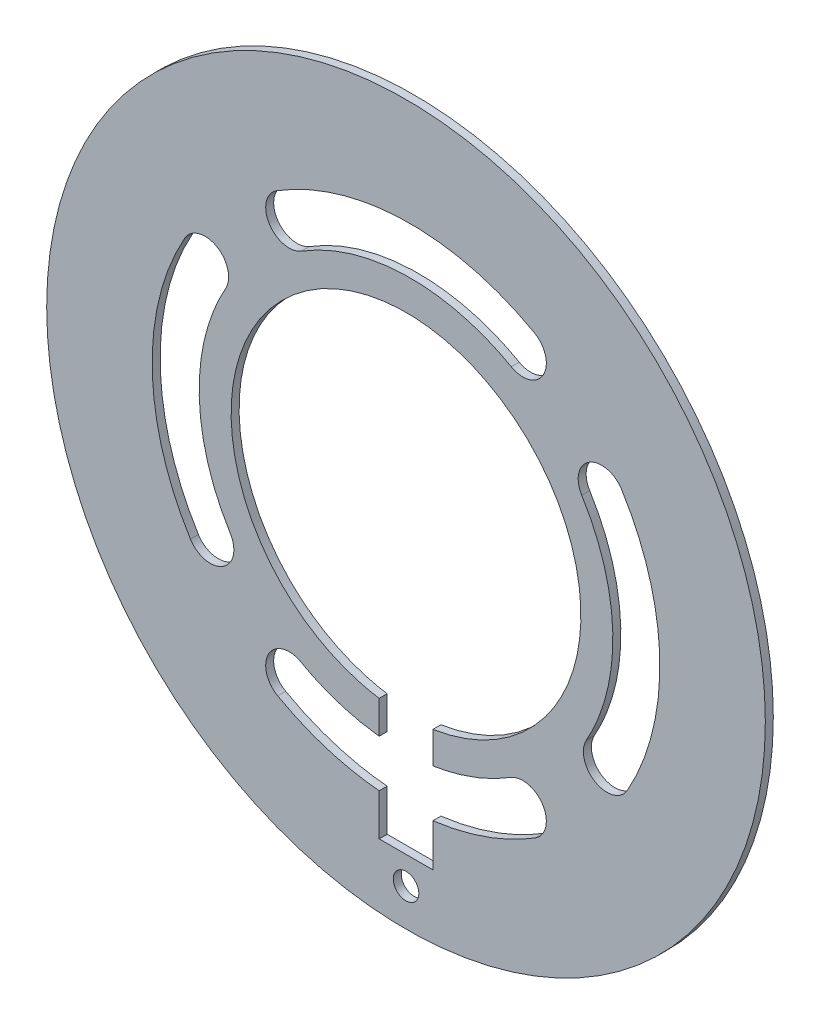
ISO-10303-21;
HEADER;
FILE_DESCRIPTION(('STEP AP214'),'2;1');
FILE_NAME('part.step','',(''),(''),'','','');
FILE_SCHEMA(('AUTOMOTIVE_DESIGN { 1 0 10303 214 1 1 1 1 }'));
ENDSEC;
DATA;
#1=APPLICATION_CONTEXT('core data for automotive mechanical design processes');
#2=APPLICATION_PROTOCOL_DEFINITION('international standard','automotive_design',2000,#1);
#3=PRODUCT_CONTEXT('',#1,'mechanical');
#4=PRODUCT('Part','Part','',(#3));
#5=PRODUCT_RELATED_PRODUCT_CATEGORY('part','',(#4));
#6=PRODUCT_DEFINITION_FORMATION('','',#4);
#7=PRODUCT_DEFINITION_CONTEXT('part definition',#1,'design');
#8=PRODUCT_DEFINITION('design','',#6,#7);
#9=PRODUCT_DEFINITION_SHAPE('','',#8);
#10=(LENGTH_UNIT() NAMED_UNIT(*) SI_UNIT(.MILLI.,.METRE.));
#11=(NAMED_UNIT(*) PLANE_ANGLE_UNIT() SI_UNIT($,.RADIAN.));
#12=(NAMED_UNIT(*) SI_UNIT($,.STERADIAN.) SOLID_ANGLE_UNIT());
#13=UNCERTAINTY_MEASURE_WITH_UNIT(LENGTH_MEASURE(1.E-05),#10,'distance_accuracy_value','');
#14=(GEOMETRIC_REPRESENTATION_CONTEXT(3) GLOBAL_UNCERTAINTY_ASSIGNED_CONTEXT((#13)) GLOBAL_UNIT_ASSIGNED_CONTEXT((#10,
#11,#12)) REPRESENTATION_CONTEXT('',''));
#15=CARTESIAN_POINT('',(0.,0.,0.));
#16=DIRECTION('',(0.,0.,1.));
#17=DIRECTION('',(1.,0.,0.));
#18=AXIS2_PLACEMENT_3D('',#15,#16,#17);
#19=CARTESIAN_POINT('',(598.931529384408,540.028739073158,3.175));
#20=DIRECTION('',(0.,0.,1.));
#21=DIRECTION('',(1.,0.,0.));
#22=AXIS2_PLACEMENT_3D('',#19,#20,#21);
#23=PLANE('',#22);
#24=CARTESIAN_POINT('',(527.193490154507,581.893635075168,3.175));
#25=CARTESIAN_POINT('',(529.723813675924,586.391521364701,3.175));
#26=CARTESIAN_POINT('',(528.128788904299,592.089011137368,3.175));
#27=CARTESIAN_POINT('',(519.133016325162,597.149658180176,3.175));
#28=CARTESIAN_POINT('',(513.435526552496,595.554633408547,3.175));
#29=CARTESIAN_POINT('',(510.905203031075,591.056747119014,3.175));
#30=B_SPLINE_CURVE_WITH_KNOTS('',3,(#24,#25,#26,#27,#28,#29),.UNSPECIFIED.,.F.,.F.,(4,2,4),(0.,
1.,2.),.UNSPECIFIED.);
#31=CARTESIAN_POINT('',(527.193490154507,581.893635075168,3.175));
#32=VERTEX_POINT('',#31);
#33=CARTESIAN_POINT('',(510.905203031075,591.056747119014,3.175));
#34=VERTEX_POINT('',#33);
#35=EDGE_CURVE('E216',#32,#34,#30,.T.);
#36=ORIENTED_EDGE('',*,*,#35,.F.);
#37=CARTESIAN_POINT('',(529.061711827445,498.524242919844,3.175));
#38=CARTESIAN_POINT('',(513.257911632386,523.886728826037,3.175));
#39=CARTESIAN_POINT('',(512.541677646352,555.848670452942,3.175));
#40=CARTESIAN_POINT('',(527.193490154507,581.893635075168,3.175));
#41=B_SPLINE_CURVE_WITH_KNOTS('',3,(#37,#38,#39,#40),.UNSPECIFIED.,.F.,.F.,(4,4),(0.,1.),.UNSPECIFIED.);
#42=CARTESIAN_POINT('',(529.061711827445,498.524242919844,3.175));
#43=VERTEX_POINT('',#42);
#44=EDGE_CURVE('E207',#43,#32,#41,.T.);
#45=ORIENTED_EDGE('',*,*,#44,.F.);
#46=CARTESIAN_POINT('',(513.200240767801,488.640688115535,3.175));
#47=CARTESIAN_POINT('',(515.929509064051,484.260663827481,3.175));
#48=CARTESIAN_POINT('',(521.692729411678,482.922461691601,3.175));
#49=CARTESIAN_POINT('',(530.452777987783,488.380998284105,3.175));
#50=CARTESIAN_POINT('',(531.790980123664,494.144218631728,3.175));
#51=CARTESIAN_POINT('',(529.061711827445,498.524242919844,3.175));
#52=B_SPLINE_CURVE_WITH_KNOTS('',3,(#46,#47,#48,#49,#50,#51),.UNSPECIFIED.,.F.,.F.,(4,2,4),(0.,
1.,2.),.UNSPECIFIED.);
#53=CARTESIAN_POINT('',(513.200240767801,488.640688115535,3.175));
#54=VERTEX_POINT('',#53);
#55=EDGE_CURVE('E234',#54,#43,#52,.T.);
#56=ORIENTED_EDGE('',*,*,#55,.F.);
#57=CARTESIAN_POINT('',(510.905203031075,591.056747119014,3.175));
#58=CARTESIAN_POINT('',(492.90602065073,559.061520039485,3.175));
#59=CARTESIAN_POINT('',(493.785886273802,519.797516609711,3.175));
#60=CARTESIAN_POINT('',(513.200240767801,488.640688115535,3.175));
#61=B_SPLINE_CURVE_WITH_KNOTS('',3,(#57,#58,#59,#60),.UNSPECIFIED.,.F.,.F.,(4,4),(0.,1.),.UNSPECIFIED.);
#62=EDGE_CURVE('E230',#34,#54,#61,.T.);
#63=ORIENTED_EDGE('',*,*,#62,.F.);
#64=EDGE_LOOP('',(#36,#45,#56,#63));
#65=FACE_BOUND('',#64,.T.);
#66=CARTESIAN_POINT('',(547.903875941348,452.002511991626,3.175));
#67=CARTESIAN_POINT('',(560.318178706482,445.018742223746,3.175));
#68=CARTESIAN_POINT('',(574.075306667745,440.753866735786,3.175));
#69=CARTESIAN_POINT('',(588.263058768805,439.490678850359,3.175));
#70=B_SPLINE_CURVE_WITH_KNOTS('',3,(#66,#67,#68,#69),.UNSPECIFIED.,.F.,.F.,(4,4),(0.,1.),.UNSPECIFIED.);
#71=CARTESIAN_POINT('',(547.903875941348,452.002511991626,3.175));
#72=VERTEX_POINT('',#71);
#73=CARTESIAN_POINT('',(588.263058768805,439.490678850359,3.175));
#74=VERTEX_POINT('',#73);
#75=EDGE_CURVE('E570',#72,#74,#70,.T.);
#76=ORIENTED_EDGE('',*,*,#75,.F.);
#77=CARTESIAN_POINT('',(557.066987985229,468.290799115072,3.175));
#78=CARTESIAN_POINT('',(552.56910169566,470.821122636475,3.175));
#79=CARTESIAN_POINT('',(546.871611922994,469.22609786485,3.175));
#80=CARTESIAN_POINT('',(541.810964880186,460.230325285713,3.175));
#81=CARTESIAN_POINT('',(543.405989651814,454.532835513046,3.175));
#82=CARTESIAN_POINT('',(547.903875941348,452.002511991626,3.175));
#83=B_SPLINE_CURVE_WITH_KNOTS('',3,(#77,#78,#79,#80,#81,#82),.UNSPECIFIED.,.F.,.F.,(4,2,4),(0.,
1.,2.),.UNSPECIFIED.);
#84=CARTESIAN_POINT('',(557.066987985229,468.290799115072,3.175));
#85=VERTEX_POINT('',#84);
#86=EDGE_CURVE('E357',#85,#72,#83,.T.);
#87=ORIENTED_EDGE('',*,*,#86,.F.);
#88=CARTESIAN_POINT('',(588.263058768805,458.270419271756,3.175));
#89=CARTESIAN_POINT('',(577.295001116456,459.472472333348,3.175));
#90=CARTESIAN_POINT('',(566.683478219793,462.880962167781,3.175));
#91=CARTESIAN_POINT('',(557.066987985229,468.290799115072,3.175));
#92=B_SPLINE_CURVE_WITH_KNOTS('',3,(#88,#89,#90,#91),.UNSPECIFIED.,.F.,.F.,(4,4),(0.,1.),.UNSPECIFIED.);
#93=CARTESIAN_POINT('',(588.263058768805,458.270419271756,3.175));
#94=VERTEX_POINT('',#93);
#95=EDGE_CURVE('E265',#94,#85,#92,.T.);
#96=ORIENTED_EDGE('',*,*,#95,.F.);
#97=DIRECTION('',(0.,-1.,0.));
#98=VECTOR('',#97,1.);
#99=CARTESIAN_POINT('',(588.263058768805,471.322082665456,3.175));
#100=LINE('',#99,#98);
#101=CARTESIAN_POINT('',(588.263058768805,471.322082665456,3.175));
#102=VERTEX_POINT('',#101);
#103=EDGE_CURVE('E273',#102,#94,#100,.T.);
#104=ORIENTED_EDGE('',*,*,#103,.F.);
#105=CARTESIAN_POINT('',(609.626414931606,471.326189461556,3.175));
#106=CARTESIAN_POINT('',(647.569785356593,477.232811650486,3.175));
#107=CARTESIAN_POINT('',(673.5407011849,512.780254195403,3.175));
#108=CARTESIAN_POINT('',(661.727456807076,588.666995045344,3.175));
#109=CARTESIAN_POINT('',(626.180014262164,614.637910873654,3.175));
#110=CARTESIAN_POINT('',(550.293273412222,602.824666495826,3.175));
#111=CARTESIAN_POINT('',(524.322357583912,567.277223950914,3.175));
#112=CARTESIAN_POINT('',(530.228979772824,529.333853525943,3.175));
#113=CARTESIAN_POINT('',(534.884697335629,499.426131239053,3.175));
#114=CARTESIAN_POINT('',(558.353548703794,475.966301230858,3.175));
#115=CARTESIAN_POINT('',(588.263058768805,471.322082665456,3.175));
#116=B_SPLINE_CURVE_WITH_KNOTS('',3,(#105,#106,#107,#108,#109,#110,#111,#112,#113,#114,#115),
.UNSPECIFIED.,.F.,.F.,(4,2,2,3,4),(0.,1.,2.,3.,4.),.UNSPECIFIED.);
#117=CARTESIAN_POINT('',(609.626414931606,471.326189461556,3.175));
#118=VERTEX_POINT('',#117);
#119=EDGE_CURVE('E1025',#118,#102,#116,.T.);
#120=ORIENTED_EDGE('',*,*,#119,.F.);
#121=DIRECTION('',(0.,1.,0.));
#122=VECTOR('',#121,1.);
#123=CARTESIAN_POINT('',(609.626414931606,458.736713526057,3.175));
#124=LINE('',#123,#122);
#125=CARTESIAN_POINT('',(609.626414931606,458.736713526057,3.175));
#126=VERTEX_POINT('',#125);
#127=EDGE_CURVE('E1022',#126,#118,#124,.T.);
#128=ORIENTED_EDGE('',*,*,#127,.F.);
#129=CARTESIAN_POINT('',(640.436380140518,470.159020787996,3.175));
#130=CARTESIAN_POINT('',(631.044671661847,464.306886070754,3.175));
#131=CARTESIAN_POINT('',(620.563261609265,460.42106908436,3.175));
#132=CARTESIAN_POINT('',(609.626414931606,458.736713526057,3.175));
#133=B_SPLINE_CURVE_WITH_KNOTS('',3,(#129,#130,#131,#132),.UNSPECIFIED.,.F.,.F.,(4,4),(0.,1.),.UNSPECIFIED.);
#134=CARTESIAN_POINT('',(640.436380140518,470.159020787996,3.175));
#135=VERTEX_POINT('',#134);
#136=EDGE_CURVE('E1019',#135,#126,#133,.T.);
#137=ORIENTED_EDGE('',*,*,#136,.F.);
#138=CARTESIAN_POINT('',(650.319934944831,454.297549728451,3.175));
#139=CARTESIAN_POINT('',(654.699959232883,457.026818024704,3.175));
#140=CARTESIAN_POINT('',(656.038161368761,462.790038372327,3.175));
#141=CARTESIAN_POINT('',(650.57962477626,471.550086948433,3.175));
#142=CARTESIAN_POINT('',(644.816404428634,472.888289084314,3.175));
#143=CARTESIAN_POINT('',(640.436380140518,470.159020787996,3.175));
#144=B_SPLINE_CURVE_WITH_KNOTS('',3,(#138,#139,#140,#141,#142,#143),.UNSPECIFIED.,.F.,.F.,(4,2,
4),(0.,1.,2.),.UNSPECIFIED.);
#145=CARTESIAN_POINT('',(650.319934944831,454.297549728451,3.175));
#146=VERTEX_POINT('',#145);
#147=EDGE_CURVE('E1016',#146,#135,#144,.T.);
#148=ORIENTED_EDGE('',*,*,#147,.F.);
#149=CARTESIAN_POINT('',(609.626414931606,439.869117325256,3.175));
#150=CARTESIAN_POINT('',(624.076093150978,441.67341332509,3.175));
#151=CARTESIAN_POINT('',(637.961028613579,446.596503111349,3.175));
#152=CARTESIAN_POINT('',(650.319934944831,454.297549728451,3.175));
#153=B_SPLINE_CURVE_WITH_KNOTS('',3,(#149,#150,#151,#152),.UNSPECIFIED.,.F.,.F.,(4,4),(0.,1.),.UNSPECIFIED.);
#154=CARTESIAN_POINT('',(609.626414931606,439.869117325256,3.175));
#155=VERTEX_POINT('',#154);
#156=EDGE_CURVE('E1013',#155,#146,#153,.T.);
#157=ORIENTED_EDGE('',*,*,#156,.F.);
#158=DIRECTION('',(0.,1.,0.));
#159=VECTOR('',#158,1.);
#160=CARTESIAN_POINT('',(609.62641493162,432.467771759757,3.175));
#161=LINE('',#160,#159);
#162=CARTESIAN_POINT('',(609.62641493162,422.942771759757,3.175));
#163=VERTEX_POINT('',#162);
#164=EDGE_CURVE('E1010',#163,#155,#161,.T.);
#165=ORIENTED_EDGE('',*,*,#164,.F.);
#166=DIRECTION('',(1.,0.,0.));
#167=VECTOR('',#166,1.);
#168=CARTESIAN_POINT('',(588.263058768805,422.942771759757,3.175));
#169=LINE('',#168,#167);
#170=CARTESIAN_POINT('',(588.263058768805,422.942771759757,3.175));
#171=VERTEX_POINT('',#170);
#172=EDGE_CURVE('E1008',#171,#163,#169,.T.);
#173=ORIENTED_EDGE('',*,*,#172,.F.);
#174=DIRECTION('',(0.,-1.,0.));
#175=VECTOR('',#174,1.);
#176=CARTESIAN_POINT('',(588.263058768805,439.490678850359,3.175));
#177=LINE('',#176,#175);
#178=EDGE_CURVE('E1006',#74,#171,#177,.T.);
#179=ORIENTED_EDGE('',*,*,#178,.F.);
#180=EDGE_LOOP('',(#76,#87,#96,#104,#120,#128,#137,#148,#157,#165,#173,#179));
#181=FACE_BOUND('',#180,.T.);
#182=CARTESIAN_POINT('',(640.796326114618,611.767132905858,3.175));
#183=CARTESIAN_POINT('',(645.29421240415,609.236809384537,3.175));
#184=CARTESIAN_POINT('',(650.991702176817,610.831834156166,3.175));
#185=CARTESIAN_POINT('',(656.052349219626,619.827606735302,3.175));
#186=CARTESIAN_POINT('',(654.457324447997,625.525096507969,3.175));
#187=CARTESIAN_POINT('',(649.959438158463,628.055420029286,3.175));
#188=B_SPLINE_CURVE_WITH_KNOTS('',3,(#182,#183,#184,#185,#186,#187),.UNSPECIFIED.,.F.,.F.,(4,2,
4),(0.,1.,2.),.UNSPECIFIED.);
#189=CARTESIAN_POINT('',(640.796326114618,611.767132905858,3.175));
#190=VERTEX_POINT('',#189);
#191=CARTESIAN_POINT('',(649.959438158463,628.055420029286,3.175));
#192=VERTEX_POINT('',#191);
#193=EDGE_CURVE('E407',#190,#192,#188,.T.);
#194=ORIENTED_EDGE('',*,*,#193,.F.);
#195=CARTESIAN_POINT('',(557.426933959293,609.89891123292,3.175));
#196=CARTESIAN_POINT('',(582.789419865485,625.702711427979,3.175));
#197=CARTESIAN_POINT('',(614.751361492391,626.418945414013,3.175));
#198=CARTESIAN_POINT('',(640.796326114618,611.767132905858,3.175));
#199=B_SPLINE_CURVE_WITH_KNOTS('',3,(#195,#196,#197,#198),.UNSPECIFIED.,.F.,.F.,(4,4),(0.,1.),.UNSPECIFIED.);
#200=CARTESIAN_POINT('',(557.426933959293,609.89891123292,3.175));
#201=VERTEX_POINT('',#200);
#202=EDGE_CURVE('E401',#201,#190,#199,.T.);
#203=ORIENTED_EDGE('',*,*,#202,.F.);
#204=CARTESIAN_POINT('',(547.543379154984,625.760382292561,3.175));
#205=CARTESIAN_POINT('',(543.163354866931,623.03111399631,3.175));
#206=CARTESIAN_POINT('',(541.82515273105,617.267893648685,3.175));
#207=CARTESIAN_POINT('',(547.283689323554,608.507845072582,3.175));
#208=CARTESIAN_POINT('',(553.046909671177,607.169642936702,3.175));
#209=CARTESIAN_POINT('',(557.426933959293,609.89891123292,3.175));
#210=B_SPLINE_CURVE_WITH_KNOTS('',3,(#204,#205,#206,#207,#208,#209),.UNSPECIFIED.,.F.,.F.,(4,2,
4),(0.,1.,2.),.UNSPECIFIED.);
#211=CARTESIAN_POINT('',(547.543379154984,625.760382292561,3.175));
#212=VERTEX_POINT('',#211);
#213=EDGE_CURVE('E591',#212,#201,#210,.T.);
#214=ORIENTED_EDGE('',*,*,#213,.F.);
#215=CARTESIAN_POINT('',(649.959438158463,628.055420029286,3.175));
#216=CARTESIAN_POINT('',(617.964211078935,646.054602409632,3.175));
#217=CARTESIAN_POINT('',(578.70020764916,645.174736786559,3.175));
#218=CARTESIAN_POINT('',(547.543379154984,625.760382292561,3.175));
#219=B_SPLINE_CURVE_WITH_KNOTS('',3,(#215,#216,#217,#218),.UNSPECIFIED.,.F.,.F.,(4,4),(0.,1.),.UNSPECIFIED.);
#220=EDGE_CURVE('E598',#192,#212,#219,.T.);
#221=ORIENTED_EDGE('',*,*,#220,.F.);
#222=EDGE_LOOP('',(#194,#203,#214,#221));
#223=FACE_BOUND('',#222,.T.);
#224=CARTESIAN_POINT('',(670.669823945307,498.164296945847,3.175));
#225=CARTESIAN_POINT('',(668.139500423887,493.666410656212,3.175));
#226=CARTESIAN_POINT('',(669.734525195516,487.968920883545,3.175));
#227=CARTESIAN_POINT('',(678.730297774649,482.908273840737,3.175));
#228=CARTESIAN_POINT('',(684.427787547319,484.503298612365,3.175));
#229=CARTESIAN_POINT('',(686.958111068735,489.001184901997,3.175));
#230=B_SPLINE_CURVE_WITH_KNOTS('',3,(#224,#225,#226,#227,#228,#229),.UNSPECIFIED.,.F.,.F.,(4,2,
4),(0.,1.,2.),.UNSPECIFIED.);
#231=CARTESIAN_POINT('',(670.669823945307,498.164296945847,3.175));
#232=VERTEX_POINT('',#231);
#233=CARTESIAN_POINT('',(686.958111068735,489.001184901997,3.175));
#234=VERTEX_POINT('',#233);
#235=EDGE_CURVE('E652',#232,#234,#230,.T.);
#236=ORIENTED_EDGE('',*,*,#235,.F.);
#237=CARTESIAN_POINT('',(668.801602272369,581.533689101171,3.175));
#238=CARTESIAN_POINT('',(684.605402467428,556.171203194979,3.175));
#239=CARTESIAN_POINT('',(685.321636453462,524.209261568073,3.175));
#240=CARTESIAN_POINT('',(670.669823945307,498.164296945847,3.175));
#241=B_SPLINE_CURVE_WITH_KNOTS('',3,(#237,#238,#239,#240),.UNSPECIFIED.,.F.,.F.,(4,4),(0.,1.),.UNSPECIFIED.);
#242=CARTESIAN_POINT('',(668.801602272369,581.533689101171,3.175));
#243=VERTEX_POINT('',#242);
#244=EDGE_CURVE('E481',#243,#232,#241,.T.);
#245=ORIENTED_EDGE('',*,*,#244,.F.);
#246=CARTESIAN_POINT('',(684.66307333201,591.417243905382,3.175));
#247=CARTESIAN_POINT('',(681.93380503576,595.797268193435,3.175));
#248=CARTESIAN_POINT('',(676.170584688133,597.135470329315,3.175));
#249=CARTESIAN_POINT('',(667.410536112031,591.676933736811,3.175));
#250=CARTESIAN_POINT('',(666.072333976151,585.913713389185,3.175));
#251=CARTESIAN_POINT('',(668.801602272369,581.533689101171,3.175));
#252=B_SPLINE_CURVE_WITH_KNOTS('',3,(#246,#247,#248,#249,#250,#251),.UNSPECIFIED.,.F.,.F.,(4,2,
4),(0.,1.,2.),.UNSPECIFIED.);
#253=CARTESIAN_POINT('',(684.66307333201,591.417243905382,3.175));
#254=VERTEX_POINT('',#253);
#255=EDGE_CURVE('E432',#254,#243,#252,.T.);
#256=ORIENTED_EDGE('',*,*,#255,.F.);
#257=CARTESIAN_POINT('',(686.958111068735,489.001184901997,3.175));
#258=CARTESIAN_POINT('',(704.957293449081,520.996411981526,3.175));
#259=CARTESIAN_POINT('',(704.077427826008,560.260415411304,3.175));
#260=CARTESIAN_POINT('',(684.66307333201,591.417243905382,3.175));
#261=B_SPLINE_CURVE_WITH_KNOTS('',3,(#257,#258,#259,#260),.UNSPECIFIED.,.F.,.F.,(4,4),(0.,1.),.UNSPECIFIED.);
#262=EDGE_CURVE('E439',#234,#254,#261,.T.);
#263=ORIENTED_EDGE('',*,*,#262,.F.);
#264=EDGE_LOOP('',(#236,#245,#256,#263));
#265=FACE_BOUND('',#264,.T.);
#266=CARTESIAN_POINT('',(598.931529384408,540.028739073158,3.175));
#267=DIRECTION('',(0.,0.,1.));
#268=DIRECTION('',(1.,0.,0.));
#269=AXIS2_PLACEMENT_3D('',#266,#267,#268);
#270=CIRCLE('',#269,142.875);
#271=CARTESIAN_POINT('',(741.806529384408,540.028739073158,3.175));
#272=VERTEX_POINT('',#271);
#273=EDGE_CURVE('E11',#272,#272,#270,.T.);
#274=ORIENTED_EDGE('',*,*,#273,.T.);
#275=EDGE_LOOP('',(#274));
#276=FACE_BOUND('',#275,.T.);
#277=CARTESIAN_POINT('',(598.944736850212,411.995371759757,3.175));
#278=DIRECTION('',(0.,0.,1.));
#279=DIRECTION('',(1.,0.,0.));
#280=AXIS2_PLACEMENT_3D('',#277,#278,#279);
#281=CIRCLE('',#280,5.07999999999886);
#282=CARTESIAN_POINT('',(604.02473685021,411.995371759757,3.175));
#283=VERTEX_POINT('',#282);
#284=EDGE_CURVE('E519',#283,#283,#281,.T.);
#285=ORIENTED_EDGE('',*,*,#284,.F.);
#286=EDGE_LOOP('',(#285));
#287=FACE_BOUND('',#286,.T.);
#288=ADVANCED_FACE('F45',(#65,#181,#223,#265,#276,#287),#23,.T.);
#289=CARTESIAN_POINT('',(598.931529384408,540.028739073158,0.));
#290=DIRECTION('',(0.,0.,1.));
#291=DIRECTION('',(1.,0.,0.));
#292=AXIS2_PLACEMENT_3D('',#289,#290,#291);
#293=PLANE('',#292);
#294=CARTESIAN_POINT('',(557.066987985229,468.290799115072,0.));
#295=CARTESIAN_POINT('',(552.56910169566,470.821122636475,0.));
#296=CARTESIAN_POINT('',(546.871611922994,469.22609786485,0.));
#297=CARTESIAN_POINT('',(541.810964880186,460.230325285713,0.));
#298=CARTESIAN_POINT('',(543.405989651814,454.532835513046,0.));
#299=CARTESIAN_POINT('',(547.903875941348,452.002511991626,0.));
#300=B_SPLINE_CURVE_WITH_KNOTS('',3,(#294,#295,#296,#297,#298,#299),.UNSPECIFIED.,.F.,.F.,(4,2,
4),(0.,1.,2.),.UNSPECIFIED.);
#301=CARTESIAN_POINT('',(557.066987985229,468.290799115072,0.));
#302=VERTEX_POINT('',#301);
#303=CARTESIAN_POINT('',(547.903875941348,452.002511991626,0.));
#304=VERTEX_POINT('',#303);
#305=EDGE_CURVE('E225',#302,#304,#300,.T.);
#306=ORIENTED_EDGE('',*,*,#305,.T.);
#307=CARTESIAN_POINT('',(547.903875941348,452.002511991626,0.));
#308=CARTESIAN_POINT('',(560.318178706482,445.018742223746,0.));
#309=CARTESIAN_POINT('',(574.075306667745,440.753866735786,0.));
#310=CARTESIAN_POINT('',(588.263058768805,439.490678850359,0.));
#311=B_SPLINE_CURVE_WITH_KNOTS('',3,(#307,#308,#309,#310),.UNSPECIFIED.,.F.,.F.,(4,4),(0.,1.),.UNSPECIFIED.);
#312=CARTESIAN_POINT('',(588.263058768805,439.490678850359,0.));
#313=VERTEX_POINT('',#312);
#314=EDGE_CURVE('E283',#304,#313,#311,.T.);
#315=ORIENTED_EDGE('',*,*,#314,.T.);
#316=DIRECTION('',(0.,-1.,0.));
#317=VECTOR('',#316,1.);
#318=CARTESIAN_POINT('',(588.263058768805,432.467771759757,0.));
#319=LINE('',#318,#317);
#320=CARTESIAN_POINT('',(588.263058768805,422.942771759757,0.));
#321=VERTEX_POINT('',#320);
#322=EDGE_CURVE('E292',#313,#321,#319,.T.);
#323=ORIENTED_EDGE('',*,*,#322,.T.);
#324=DIRECTION('',(1.,0.,0.));
#325=VECTOR('',#324,1.);
#326=CARTESIAN_POINT('',(588.263058768805,422.942771759757,0.));
#327=LINE('',#326,#325);
#328=CARTESIAN_POINT('',(609.62641493162,422.942771759757,0.));
#329=VERTEX_POINT('',#328);
#330=EDGE_CURVE('E299',#321,#329,#327,.T.);
#331=ORIENTED_EDGE('',*,*,#330,.T.);
#332=DIRECTION('',(-1.89003607337098E-12,1.,0.));
#333=VECTOR('',#332,1.);
#334=CARTESIAN_POINT('',(609.62641493162,432.467771759757,0.));
#335=LINE('',#334,#333);
#336=CARTESIAN_POINT('',(609.626414931606,439.869117325256,0.));
#337=VERTEX_POINT('',#336);
#338=EDGE_CURVE('E303',#329,#337,#335,.T.);
#339=ORIENTED_EDGE('',*,*,#338,.T.);
#340=CARTESIAN_POINT('',(609.626414931606,439.869117325256,0.));
#341=CARTESIAN_POINT('',(624.076093150978,441.67341332509,0.));
#342=CARTESIAN_POINT('',(637.961028613579,446.596503111349,0.));
#343=CARTESIAN_POINT('',(650.319934944831,454.297549728451,0.));
#344=B_SPLINE_CURVE_WITH_KNOTS('',3,(#340,#341,#342,#343),.UNSPECIFIED.,.F.,.F.,(4,4),(0.,1.),.UNSPECIFIED.);
#345=CARTESIAN_POINT('',(650.319934944831,454.297549728451,0.));
#346=VERTEX_POINT('',#345);
#347=EDGE_CURVE('E307',#337,#346,#344,.T.);
#348=ORIENTED_EDGE('',*,*,#347,.T.);
#349=CARTESIAN_POINT('',(650.319934944831,454.297549728451,0.));
#350=CARTESIAN_POINT('',(654.699959232883,457.026818024704,0.));
#351=CARTESIAN_POINT('',(656.038161368761,462.790038372327,0.));
#352=CARTESIAN_POINT('',(650.57962477626,471.550086948433,0.));
#353=CARTESIAN_POINT('',(644.816404428634,472.888289084314,0.));
#354=CARTESIAN_POINT('',(640.436380140518,470.159020787996,0.));
#355=B_SPLINE_CURVE_WITH_KNOTS('',3,(#349,#350,#351,#352,#353,#354),.UNSPECIFIED.,.F.,.F.,(4,2,
4),(0.,1.,2.),.UNSPECIFIED.);
#356=CARTESIAN_POINT('',(640.436380140518,470.159020787996,0.));
#357=VERTEX_POINT('',#356);
#358=EDGE_CURVE('E313',#346,#357,#355,.T.);
#359=ORIENTED_EDGE('',*,*,#358,.T.);
#360=CARTESIAN_POINT('',(640.436380140518,470.159020787996,0.));
#361=CARTESIAN_POINT('',(631.044671661847,464.306886070754,0.));
#362=CARTESIAN_POINT('',(620.563261609265,460.42106908436,0.));
#363=CARTESIAN_POINT('',(609.626414931606,458.736713526057,0.));
#364=B_SPLINE_CURVE_WITH_KNOTS('',3,(#360,#361,#362,#363),.UNSPECIFIED.,.F.,.F.,(4,4),(0.,1.),.UNSPECIFIED.);
#365=CARTESIAN_POINT('',(609.626414931606,458.736713526057,0.));
#366=VERTEX_POINT('',#365);
#367=EDGE_CURVE('E322',#357,#366,#364,.T.);
#368=ORIENTED_EDGE('',*,*,#367,.T.);
#369=DIRECTION('',(0.,1.,0.));
#370=VECTOR('',#369,1.);
#371=CARTESIAN_POINT('',(609.626414931606,458.736713526057,0.));
#372=LINE('',#371,#370);
#373=CARTESIAN_POINT('',(609.626414931606,471.326189461556,0.));
#374=VERTEX_POINT('',#373);
#375=EDGE_CURVE('E331',#366,#374,#372,.T.);
#376=ORIENTED_EDGE('',*,*,#375,.T.);
#377=CARTESIAN_POINT('',(609.626414931606,471.326189461556,0.));
#378=CARTESIAN_POINT('',(647.569785356593,477.232811650486,0.));
#379=CARTESIAN_POINT('',(673.5407011849,512.780254195403,0.));
#380=CARTESIAN_POINT('',(661.727456807076,588.666995045344,0.));
#381=CARTESIAN_POINT('',(626.180014262164,614.637910873654,0.));
#382=CARTESIAN_POINT('',(550.293273412222,602.824666495826,0.));
#383=CARTESIAN_POINT('',(524.322357583912,567.277223950914,0.));
#384=CARTESIAN_POINT('',(530.228979772824,529.333853525943,0.));
#385=CARTESIAN_POINT('',(534.884697335629,499.426131239053,0.));
#386=CARTESIAN_POINT('',(558.353548703794,475.966301230858,0.));
#387=CARTESIAN_POINT('',(588.263058768805,471.322082665456,0.));
#388=B_SPLINE_CURVE_WITH_KNOTS('',3,(#377,#378,#379,#380,#381,#382,#383,#384,#385,#386,#387),
.UNSPECIFIED.,.F.,.F.,(4,2,2,3,4),(0.,1.,2.,3.,4.),.UNSPECIFIED.);
#389=CARTESIAN_POINT('',(588.263058768805,471.322082665456,0.));
#390=VERTEX_POINT('',#389);
#391=EDGE_CURVE('E338',#374,#390,#388,.T.);
#392=ORIENTED_EDGE('',*,*,#391,.T.);
#393=DIRECTION('',(0.,-1.,0.));
#394=VECTOR('',#393,1.);
#395=CARTESIAN_POINT('',(588.263058768805,471.322082665456,0.));
#396=LINE('',#395,#394);
#397=CARTESIAN_POINT('',(588.263058768805,458.270419271756,0.));
#398=VERTEX_POINT('',#397);
#399=EDGE_CURVE('E344',#390,#398,#396,.T.);
#400=ORIENTED_EDGE('',*,*,#399,.T.);
#401=CARTESIAN_POINT('',(588.263058768805,458.270419271756,0.));
#402=CARTESIAN_POINT('',(577.295001116456,459.472472333348,0.));
#403=CARTESIAN_POINT('',(566.683478219793,462.880962167781,0.));
#404=CARTESIAN_POINT('',(557.066987985229,468.290799115072,0.));
#405=B_SPLINE_CURVE_WITH_KNOTS('',3,(#401,#402,#403,#404),.UNSPECIFIED.,.F.,.F.,(4,4),(0.,1.),.UNSPECIFIED.);
#406=EDGE_CURVE('E351',#398,#302,#405,.T.);
#407=ORIENTED_EDGE('',*,*,#406,.T.);
#408=EDGE_LOOP('',(#306,#315,#323,#331,#339,#348,#359,#368,#376,#392,#400,#407));
#409=FACE_BOUND('',#408,.T.);
#410=CARTESIAN_POINT('',(668.801602272369,581.533689101171,0.));
#411=CARTESIAN_POINT('',(684.605402467428,556.171203194979,0.));
#412=CARTESIAN_POINT('',(685.321636453462,524.209261568073,0.));
#413=CARTESIAN_POINT('',(670.669823945307,498.164296945847,0.));
#414=B_SPLINE_CURVE_WITH_KNOTS('',3,(#410,#411,#412,#413),.UNSPECIFIED.,.F.,.F.,(4,4),(0.,1.),.UNSPECIFIED.);
#415=CARTESIAN_POINT('',(668.801602272369,581.533689101171,0.));
#416=VERTEX_POINT('',#415);
#417=CARTESIAN_POINT('',(670.669823945307,498.164296945847,0.));
#418=VERTEX_POINT('',#417);
#419=EDGE_CURVE('E444',#416,#418,#414,.T.);
#420=ORIENTED_EDGE('',*,*,#419,.T.);
#421=CARTESIAN_POINT('',(670.669823945307,498.164296945847,0.));
#422=CARTESIAN_POINT('',(668.139500423887,493.666410656212,0.));
#423=CARTESIAN_POINT('',(669.734525195516,487.968920883545,0.));
#424=CARTESIAN_POINT('',(678.730297774649,482.908273840737,0.));
#425=CARTESIAN_POINT('',(684.427787547319,484.503298612365,0.));
#426=CARTESIAN_POINT('',(686.958111068735,489.001184901997,0.));
#427=B_SPLINE_CURVE_WITH_KNOTS('',3,(#421,#422,#423,#424,#425,#426),.UNSPECIFIED.,.F.,.F.,(4,2,
4),(0.,1.,2.),.UNSPECIFIED.);
#428=CARTESIAN_POINT('',(686.958111068735,489.001184901997,0.));
#429=VERTEX_POINT('',#428);
#430=EDGE_CURVE('E453',#418,#429,#427,.T.);
#431=ORIENTED_EDGE('',*,*,#430,.T.);
#432=CARTESIAN_POINT('',(686.958111068735,489.001184901997,0.));
#433=CARTESIAN_POINT('',(704.957293449081,520.996411981526,0.));
#434=CARTESIAN_POINT('',(704.077427826008,560.260415411304,0.));
#435=CARTESIAN_POINT('',(684.66307333201,591.417243905382,0.));
#436=B_SPLINE_CURVE_WITH_KNOTS('',3,(#432,#433,#434,#435),.UNSPECIFIED.,.F.,.F.,(4,4),(0.,1.),.UNSPECIFIED.);
#437=CARTESIAN_POINT('',(684.66307333201,591.417243905382,0.));
#438=VERTEX_POINT('',#437);
#439=EDGE_CURVE('E463',#429,#438,#436,.T.);
#440=ORIENTED_EDGE('',*,*,#439,.T.);
#441=CARTESIAN_POINT('',(684.66307333201,591.417243905382,0.));
#442=CARTESIAN_POINT('',(681.93380503576,595.797268193435,0.));
#443=CARTESIAN_POINT('',(676.170584688133,597.135470329315,0.));
#444=CARTESIAN_POINT('',(667.410536112031,591.676933736811,0.));
#445=CARTESIAN_POINT('',(666.072333976151,585.913713389185,0.));
#446=CARTESIAN_POINT('',(668.801602272369,581.533689101171,0.));
#447=B_SPLINE_CURVE_WITH_KNOTS('',3,(#441,#442,#443,#444,#445,#446),.UNSPECIFIED.,.F.,.F.,(4,2,
4),(0.,1.,2.),.UNSPECIFIED.);
#448=EDGE_CURVE('E472',#438,#416,#447,.T.);
#449=ORIENTED_EDGE('',*,*,#448,.T.);
#450=EDGE_LOOP('',(#420,#431,#440,#449));
#451=FACE_BOUND('',#450,.T.);
#452=CARTESIAN_POINT('',(598.931529384408,540.028739073158,0.));
#453=DIRECTION('',(0.,0.,1.));
#454=DIRECTION('',(1.,0.,0.));
#455=AXIS2_PLACEMENT_3D('',#452,#453,#454);
#456=CIRCLE('',#455,142.875);
#457=CARTESIAN_POINT('',(741.806529384408,540.028739073158,0.));
#458=VERTEX_POINT('',#457);
#459=EDGE_CURVE('E49',#458,#458,#456,.T.);
#460=ORIENTED_EDGE('',*,*,#459,.F.);
#461=EDGE_LOOP('',(#460));
#462=FACE_BOUND('',#461,.T.);
#463=CARTESIAN_POINT('',(557.426933959293,609.89891123292,0.));
#464=CARTESIAN_POINT('',(582.789419865485,625.702711427979,0.));
#465=CARTESIAN_POINT('',(614.751361492391,626.418945414013,0.));
#466=CARTESIAN_POINT('',(640.796326114618,611.767132905858,0.));
#467=B_SPLINE_CURVE_WITH_KNOTS('',3,(#463,#464,#465,#466),.UNSPECIFIED.,.F.,.F.,(4,4),(0.,1.),.UNSPECIFIED.);
#468=CARTESIAN_POINT('',(557.426933959293,609.89891123292,0.));
#469=VERTEX_POINT('',#468);
#470=CARTESIAN_POINT('',(640.796326114618,611.767132905858,0.));
#471=VERTEX_POINT('',#470);
#472=EDGE_CURVE('E400',#469,#471,#467,.T.);
#473=ORIENTED_EDGE('',*,*,#472,.T.);
#474=CARTESIAN_POINT('',(640.796326114618,611.767132905858,0.));
#475=CARTESIAN_POINT('',(645.29421240415,609.236809384537,0.));
#476=CARTESIAN_POINT('',(650.991702176817,610.831834156166,0.));
#477=CARTESIAN_POINT('',(656.052349219626,619.827606735302,0.));
#478=CARTESIAN_POINT('',(654.457324447997,625.525096507969,0.));
#479=CARTESIAN_POINT('',(649.959438158463,628.055420029286,0.));
#480=B_SPLINE_CURVE_WITH_KNOTS('',3,(#474,#475,#476,#477,#478,#479),.UNSPECIFIED.,.F.,.F.,(4,2,
4),(0.,1.,2.),.UNSPECIFIED.);
#481=CARTESIAN_POINT('',(649.959438158463,628.055420029286,0.));
#482=VERTEX_POINT('',#481);
#483=EDGE_CURVE('E609',#471,#482,#480,.T.);
#484=ORIENTED_EDGE('',*,*,#483,.T.);
#485=CARTESIAN_POINT('',(649.959438158463,628.055420029286,0.));
#486=CARTESIAN_POINT('',(617.964211078935,646.054602409632,0.));
#487=CARTESIAN_POINT('',(578.70020764916,645.174736786559,0.));
#488=CARTESIAN_POINT('',(547.543379154984,625.760382292561,0.));
#489=B_SPLINE_CURVE_WITH_KNOTS('',3,(#485,#486,#487,#488),.UNSPECIFIED.,.F.,.F.,(4,4),(0.,1.),.UNSPECIFIED.);
#490=CARTESIAN_POINT('',(547.543379154984,625.760382292561,0.));
#491=VERTEX_POINT('',#490);
#492=EDGE_CURVE('E617',#482,#491,#489,.T.);
#493=ORIENTED_EDGE('',*,*,#492,.T.);
#494=CARTESIAN_POINT('',(547.543379154984,625.760382292561,0.));
#495=CARTESIAN_POINT('',(543.163354866931,623.03111399631,0.));
#496=CARTESIAN_POINT('',(541.82515273105,617.267893648685,0.));
#497=CARTESIAN_POINT('',(547.283689323554,608.507845072582,0.));
#498=CARTESIAN_POINT('',(553.046909671177,607.169642936702,0.));
#499=CARTESIAN_POINT('',(557.426933959293,609.89891123292,0.));
#500=B_SPLINE_CURVE_WITH_KNOTS('',3,(#494,#495,#496,#497,#498,#499),.UNSPECIFIED.,.F.,.F.,(4,2,
4),(0.,1.,2.),.UNSPECIFIED.);
#501=EDGE_CURVE('E408',#491,#469,#500,.T.);
#502=ORIENTED_EDGE('',*,*,#501,.T.);
#503=EDGE_LOOP('',(#473,#484,#493,#502));
#504=FACE_BOUND('',#503,.T.);
#505=CARTESIAN_POINT('',(529.061711827445,498.524242919844,0.));
#506=CARTESIAN_POINT('',(513.257911632386,523.886728826037,0.));
#507=CARTESIAN_POINT('',(512.541677646352,555.848670452942,0.));
#508=CARTESIAN_POINT('',(527.193490154507,581.893635075168,0.));
#509=B_SPLINE_CURVE_WITH_KNOTS('',3,(#505,#506,#507,#508),.UNSPECIFIED.,.F.,.F.,(4,4),(0.,1.),.UNSPECIFIED.);
#510=CARTESIAN_POINT('',(529.061711827445,498.524242919844,0.));
#511=VERTEX_POINT('',#510);
#512=CARTESIAN_POINT('',(527.193490154507,581.893635075168,0.));
#513=VERTEX_POINT('',#512);
#514=EDGE_CURVE('E69',#511,#513,#509,.T.);
#515=ORIENTED_EDGE('',*,*,#514,.T.);
#516=CARTESIAN_POINT('',(527.193490154507,581.893635075168,0.));
#517=CARTESIAN_POINT('',(529.723813675924,586.391521364701,0.));
#518=CARTESIAN_POINT('',(528.128788904299,592.089011137368,0.));
#519=CARTESIAN_POINT('',(519.133016325162,597.149658180176,0.));
#520=CARTESIAN_POINT('',(513.435526552496,595.554633408547,0.));
#521=CARTESIAN_POINT('',(510.905203031075,591.056747119014,0.));
#522=B_SPLINE_CURVE_WITH_KNOTS('',3,(#516,#517,#518,#519,#520,#521),.UNSPECIFIED.,.F.,.F.,(4,2,
4),(0.,1.,2.),.UNSPECIFIED.);
#523=CARTESIAN_POINT('',(510.905203031075,591.056747119014,0.));
#524=VERTEX_POINT('',#523);
#525=EDGE_CURVE('E223',#513,#524,#522,.T.);
#526=ORIENTED_EDGE('',*,*,#525,.T.);
#527=CARTESIAN_POINT('',(510.905203031075,591.056747119014,0.));
#528=CARTESIAN_POINT('',(492.90602065073,559.061520039485,0.));
#529=CARTESIAN_POINT('',(493.785886273802,519.797516609711,0.));
#530=CARTESIAN_POINT('',(513.200240767801,488.640688115535,0.));
#531=B_SPLINE_CURVE_WITH_KNOTS('',3,(#527,#528,#529,#530),.UNSPECIFIED.,.F.,.F.,(4,4),(0.,1.),.UNSPECIFIED.);
#532=CARTESIAN_POINT('',(513.200240767801,488.640688115535,0.));
#533=VERTEX_POINT('',#532);
#534=EDGE_CURVE('E528',#524,#533,#531,.T.);
#535=ORIENTED_EDGE('',*,*,#534,.T.);
#536=CARTESIAN_POINT('',(513.200240767801,488.640688115535,0.));
#537=CARTESIAN_POINT('',(515.929509064051,484.260663827481,0.));
#538=CARTESIAN_POINT('',(521.692729411678,482.922461691601,0.));
#539=CARTESIAN_POINT('',(530.452777987783,488.380998284105,0.));
#540=CARTESIAN_POINT('',(531.790980123664,494.144218631728,0.));
#541=CARTESIAN_POINT('',(529.061711827445,498.524242919844,0.));
#542=B_SPLINE_CURVE_WITH_KNOTS('',3,(#536,#537,#538,#539,#540,#541),.UNSPECIFIED.,.F.,.F.,(4,2,
4),(0.,1.,2.),.UNSPECIFIED.);
#543=EDGE_CURVE('E217',#533,#511,#542,.T.);
#544=ORIENTED_EDGE('',*,*,#543,.T.);
#545=EDGE_LOOP('',(#515,#526,#535,#544));
#546=FACE_BOUND('',#545,.T.);
#547=CARTESIAN_POINT('',(598.944736850212,411.995371759757,0.));
#548=DIRECTION('',(0.,0.,1.));
#549=DIRECTION('',(1.,0.,0.));
#550=AXIS2_PLACEMENT_3D('',#547,#548,#549);
#551=CIRCLE('',#550,5.07999999999886);
#552=CARTESIAN_POINT('',(604.02473685021,411.995371759757,0.));
#553=VERTEX_POINT('',#552);
#554=EDGE_CURVE('E516',#553,#553,#551,.T.);
#555=ORIENTED_EDGE('',*,*,#554,.T.);
#556=EDGE_LOOP('',(#555));
#557=FACE_BOUND('',#556,.T.);
#558=ADVANCED_FACE('F504',(#409,#451,#462,#504,#546,#557),#293,.F.);
#559=CARTESIAN_POINT('',(598.931529384408,540.028739073158,3.175));
#560=DIRECTION('',(0.,0.,-1.));
#561=DIRECTION('',(-1.,0.,0.));
#562=AXIS2_PLACEMENT_3D('',#559,#560,#561);
#563=CYLINDRICAL_SURFACE('',#562,142.875);
#564=ORIENTED_EDGE('',*,*,#273,.F.);
#565=EDGE_LOOP('',(#564));
#566=FACE_BOUND('',#565,.T.);
#567=ORIENTED_EDGE('',*,*,#459,.T.);
#568=EDGE_LOOP('',(#567));
#569=FACE_BOUND('',#568,.T.);
#570=ADVANCED_FACE('F47',(#566,#569),#563,.T.);
#571=DIRECTION('',(0.,0.,-1.));
#572=VECTOR('',#571,1.);
#573=SURFACE_OF_LINEAR_EXTRUSION('',#241,#572);
#574=ORIENTED_EDGE('',*,*,#419,.F.);
#575=DIRECTION('',(0.,0.,-1.));
#576=VECTOR('',#575,1.);
#577=CARTESIAN_POINT('',(668.801602272369,581.533689101171,3.175));
#578=LINE('',#577,#576);
#579=EDGE_CURVE('E438',#243,#416,#578,.T.);
#580=ORIENTED_EDGE('',*,*,#579,.F.);
#581=ORIENTED_EDGE('',*,*,#244,.T.);
#582=DIRECTION('',(0.,0.,-1.));
#583=VECTOR('',#582,1.);
#584=CARTESIAN_POINT('',(670.669823945307,498.164296945847,3.175));
#585=LINE('',#584,#583);
#586=EDGE_CURVE('E494',#232,#418,#585,.T.);
#587=ORIENTED_EDGE('',*,*,#586,.T.);
#588=EDGE_LOOP('',(#574,#580,#581,#587));
#589=FACE_BOUND('',#588,.T.);
#590=ADVANCED_FACE('F660',(#589),#573,.T.);
#591=DIRECTION('',(0.,0.,-1.));
#592=VECTOR('',#591,1.);
#593=SURFACE_OF_LINEAR_EXTRUSION('',#230,#592);
#594=ORIENTED_EDGE('',*,*,#430,.F.);
#595=ORIENTED_EDGE('',*,*,#586,.F.);
#596=ORIENTED_EDGE('',*,*,#235,.T.);
#597=DIRECTION('',(0.,0.,-1.));
#598=VECTOR('',#597,1.);
#599=CARTESIAN_POINT('',(686.958111068735,489.001184901997,3.175));
#600=LINE('',#599,#598);
#601=EDGE_CURVE('E491',#234,#429,#600,.T.);
#602=ORIENTED_EDGE('',*,*,#601,.T.);
#603=EDGE_LOOP('',(#594,#595,#596,#602));
#604=FACE_BOUND('',#603,.T.);
#605=ADVANCED_FACE('F663',(#604),#593,.T.);
#606=DIRECTION('',(0.,0.,-1.));
#607=VECTOR('',#606,1.);
#608=SURFACE_OF_LINEAR_EXTRUSION('',#261,#607);
#609=ORIENTED_EDGE('',*,*,#439,.F.);
#610=ORIENTED_EDGE('',*,*,#601,.F.);
#611=ORIENTED_EDGE('',*,*,#262,.T.);
#612=DIRECTION('',(0.,0.,-1.));
#613=VECTOR('',#612,1.);
#614=CARTESIAN_POINT('',(684.66307333201,591.417243905382,3.175));
#615=LINE('',#614,#613);
#616=EDGE_CURVE('E488',#254,#438,#615,.T.);
#617=ORIENTED_EDGE('',*,*,#616,.T.);
#618=EDGE_LOOP('',(#609,#610,#611,#617));
#619=FACE_BOUND('',#618,.T.);
#620=ADVANCED_FACE('F428',(#619),#608,.T.);
#621=DIRECTION('',(0.,0.,-1.));
#622=VECTOR('',#621,1.);
#623=SURFACE_OF_LINEAR_EXTRUSION('',#252,#622);
#624=ORIENTED_EDGE('',*,*,#448,.F.);
#625=ORIENTED_EDGE('',*,*,#616,.F.);
#626=ORIENTED_EDGE('',*,*,#255,.T.);
#627=ORIENTED_EDGE('',*,*,#579,.T.);
#628=EDGE_LOOP('',(#624,#625,#626,#627));
#629=FACE_BOUND('',#628,.T.);
#630=ADVANCED_FACE('F422',(#629),#623,.T.);
#631=DIRECTION('',(0.,0.,-1.));
#632=VECTOR('',#631,1.);
#633=SURFACE_OF_LINEAR_EXTRUSION('',#199,#632);
#634=ORIENTED_EDGE('',*,*,#472,.F.);
#635=DIRECTION('',(0.,0.,-1.));
#636=VECTOR('',#635,1.);
#637=CARTESIAN_POINT('',(557.426933959293,609.89891123292,3.175));
#638=LINE('',#637,#636);
#639=EDGE_CURVE('E597',#201,#469,#638,.T.);
#640=ORIENTED_EDGE('',*,*,#639,.F.);
#641=ORIENTED_EDGE('',*,*,#202,.T.);
#642=DIRECTION('',(0.,0.,-1.));
#643=VECTOR('',#642,1.);
#644=CARTESIAN_POINT('',(640.796326114618,611.767132905858,3.175));
#645=LINE('',#644,#643);
#646=EDGE_CURVE('E454',#190,#471,#645,.T.);
#647=ORIENTED_EDGE('',*,*,#646,.T.);
#648=EDGE_LOOP('',(#634,#640,#641,#647));
#649=FACE_BOUND('',#648,.T.);
#650=ADVANCED_FACE('F417',(#649),#633,.T.);
#651=DIRECTION('',(0.,0.,-1.));
#652=VECTOR('',#651,1.);
#653=SURFACE_OF_LINEAR_EXTRUSION('',#188,#652);
#654=ORIENTED_EDGE('',*,*,#483,.F.);
#655=ORIENTED_EDGE('',*,*,#646,.F.);
#656=ORIENTED_EDGE('',*,*,#193,.T.);
#657=DIRECTION('',(0.,0.,-1.));
#658=VECTOR('',#657,1.);
#659=CARTESIAN_POINT('',(649.959438158463,628.055420029286,3.175));
#660=LINE('',#659,#658);
#661=EDGE_CURVE('E642',#192,#482,#660,.T.);
#662=ORIENTED_EDGE('',*,*,#661,.T.);
#663=EDGE_LOOP('',(#654,#655,#656,#662));
#664=FACE_BOUND('',#663,.T.);
#665=ADVANCED_FACE('F421',(#664),#653,.T.);
#666=DIRECTION('',(0.,0.,-1.));
#667=VECTOR('',#666,1.);
#668=SURFACE_OF_LINEAR_EXTRUSION('',#219,#667);
#669=ORIENTED_EDGE('',*,*,#492,.F.);
#670=ORIENTED_EDGE('',*,*,#661,.F.);
#671=ORIENTED_EDGE('',*,*,#220,.T.);
#672=DIRECTION('',(0.,0.,-1.));
#673=VECTOR('',#672,1.);
#674=CARTESIAN_POINT('',(547.543379154984,625.760382292561,3.175));
#675=LINE('',#674,#673);
#676=EDGE_CURVE('E639',#212,#491,#675,.T.);
#677=ORIENTED_EDGE('',*,*,#676,.T.);
#678=EDGE_LOOP('',(#669,#670,#671,#677));
#679=FACE_BOUND('',#678,.T.);
#680=ADVANCED_FACE('F589',(#679),#668,.T.);
#681=DIRECTION('',(0.,0.,-1.));
#682=VECTOR('',#681,1.);
#683=SURFACE_OF_LINEAR_EXTRUSION('',#210,#682);
#684=ORIENTED_EDGE('',*,*,#501,.F.);
#685=ORIENTED_EDGE('',*,*,#676,.F.);
#686=ORIENTED_EDGE('',*,*,#213,.T.);
#687=ORIENTED_EDGE('',*,*,#639,.T.);
#688=EDGE_LOOP('',(#684,#685,#686,#687));
#689=FACE_BOUND('',#688,.T.);
#690=ADVANCED_FACE('F584',(#689),#683,.T.);
#691=DIRECTION('',(0.,0.,-1.));
#692=VECTOR('',#691,1.);
#693=SURFACE_OF_LINEAR_EXTRUSION('',#83,#692);
#694=ORIENTED_EDGE('',*,*,#305,.F.);
#695=DIRECTION('',(0.,0.,-1.));
#696=VECTOR('',#695,1.);
#697=CARTESIAN_POINT('',(557.066987985229,468.290799115072,3.175));
#698=LINE('',#697,#696);
#699=EDGE_CURVE('E272',#85,#302,#698,.T.);
#700=ORIENTED_EDGE('',*,*,#699,.F.);
#701=ORIENTED_EDGE('',*,*,#86,.T.);
#702=DIRECTION('',(0.,0.,-1.));
#703=VECTOR('',#702,1.);
#704=CARTESIAN_POINT('',(547.903875941348,452.002511991626,3.175));
#705=LINE('',#704,#703);
#706=EDGE_CURVE('E396',#72,#304,#705,.T.);
#707=ORIENTED_EDGE('',*,*,#706,.T.);
#708=EDGE_LOOP('',(#694,#700,#701,#707));
#709=FACE_BOUND('',#708,.T.);
#710=ADVANCED_FACE('F579',(#709),#693,.T.);
#711=DIRECTION('',(0.,0.,-1.));
#712=VECTOR('',#711,1.);
#713=SURFACE_OF_LINEAR_EXTRUSION('',#70,#712);
#714=ORIENTED_EDGE('',*,*,#314,.F.);
#715=ORIENTED_EDGE('',*,*,#706,.F.);
#716=ORIENTED_EDGE('',*,*,#75,.T.);
#717=DIRECTION('',(0.,0.,-1.));
#718=VECTOR('',#717,1.);
#719=CARTESIAN_POINT('',(588.263058768805,439.490678850359,3.175));
#720=LINE('',#719,#718);
#721=EDGE_CURVE('E392',#74,#313,#720,.T.);
#722=ORIENTED_EDGE('',*,*,#721,.T.);
#723=EDGE_LOOP('',(#714,#715,#716,#722));
#724=FACE_BOUND('',#723,.T.);
#725=ADVANCED_FACE('F583',(#724),#713,.T.);
#726=CARTESIAN_POINT('',(588.263058768805,432.467771759757,3.175));
#727=DIRECTION('',(1.,0.,0.));
#728=DIRECTION('',(0.,0.,-1.));
#729=AXIS2_PLACEMENT_3D('',#726,#727,#728);
#730=PLANE('',#729);
#731=ORIENTED_EDGE('',*,*,#322,.F.);
#732=ORIENTED_EDGE('',*,*,#721,.F.);
#733=ORIENTED_EDGE('',*,*,#178,.T.);
#734=DIRECTION('',(0.,0.,-1.));
#735=VECTOR('',#734,1.);
#736=CARTESIAN_POINT('',(588.263058768805,422.942771759757,3.175));
#737=LINE('',#736,#735);
#738=EDGE_CURVE('E389',#171,#321,#737,.T.);
#739=ORIENTED_EDGE('',*,*,#738,.T.);
#740=EDGE_LOOP('',(#731,#732,#733,#739));
#741=FACE_BOUND('',#740,.T.);
#742=ADVANCED_FACE('F727',(#741),#730,.T.);
#743=CARTESIAN_POINT('',(588.263058768805,422.942771759757,3.175));
#744=DIRECTION('',(0.,1.,0.));
#745=DIRECTION('',(0.,0.,1.));
#746=AXIS2_PLACEMENT_3D('',#743,#744,#745);
#747=PLANE('',#746);
#748=ORIENTED_EDGE('',*,*,#330,.F.);
#749=ORIENTED_EDGE('',*,*,#738,.F.);
#750=ORIENTED_EDGE('',*,*,#172,.T.);
#751=DIRECTION('',(0.,0.,-1.));
#752=VECTOR('',#751,1.);
#753=CARTESIAN_POINT('',(609.62641493162,422.942771759757,3.175));
#754=LINE('',#753,#752);
#755=EDGE_CURVE('E385',#163,#329,#754,.T.);
#756=ORIENTED_EDGE('',*,*,#755,.T.);
#757=EDGE_LOOP('',(#748,#749,#750,#756));
#758=FACE_BOUND('',#757,.T.);
#759=ADVANCED_FACE('F734',(#758),#747,.T.);
#760=CARTESIAN_POINT('',(609.62641493162,432.467771759757,3.175));
#761=DIRECTION('',(-1.,-1.89003607337098E-12,0.));
#762=DIRECTION('',(1.89003607337098E-12,-1.,0.));
#763=AXIS2_PLACEMENT_3D('',#760,#761,#762);
#764=PLANE('',#763);
#765=ORIENTED_EDGE('',*,*,#338,.F.);
#766=ORIENTED_EDGE('',*,*,#755,.F.);
#767=ORIENTED_EDGE('',*,*,#164,.T.);
#768=DIRECTION('',(0.,0.,-1.));
#769=VECTOR('',#768,1.);
#770=CARTESIAN_POINT('',(609.626414931606,439.869117325256,3.175));
#771=LINE('',#770,#769);
#772=EDGE_CURVE('E382',#155,#337,#771,.T.);
#773=ORIENTED_EDGE('',*,*,#772,.T.);
#774=EDGE_LOOP('',(#765,#766,#767,#773));
#775=FACE_BOUND('',#774,.T.);
#776=ADVANCED_FACE('F741',(#775),#764,.T.);
#777=DIRECTION('',(0.,0.,-1.));
#778=VECTOR('',#777,1.);
#779=SURFACE_OF_LINEAR_EXTRUSION('',#153,#778);
#780=ORIENTED_EDGE('',*,*,#347,.F.);
#781=ORIENTED_EDGE('',*,*,#772,.F.);
#782=ORIENTED_EDGE('',*,*,#156,.T.);
#783=DIRECTION('',(0.,0.,-1.));
#784=VECTOR('',#783,1.);
#785=CARTESIAN_POINT('',(650.319934944831,454.297549728451,3.175));
#786=LINE('',#785,#784);
#787=EDGE_CURVE('E379',#146,#346,#786,.T.);
#788=ORIENTED_EDGE('',*,*,#787,.T.);
#789=EDGE_LOOP('',(#780,#781,#782,#788));
#790=FACE_BOUND('',#789,.T.);
#791=ADVANCED_FACE('F749',(#790),#779,.T.);
#792=DIRECTION('',(0.,0.,-1.));
#793=VECTOR('',#792,1.);
#794=SURFACE_OF_LINEAR_EXTRUSION('',#144,#793);
#795=ORIENTED_EDGE('',*,*,#358,.F.);
#796=ORIENTED_EDGE('',*,*,#787,.F.);
#797=ORIENTED_EDGE('',*,*,#147,.T.);
#798=DIRECTION('',(0.,0.,-1.));
#799=VECTOR('',#798,1.);
#800=CARTESIAN_POINT('',(640.436380140518,470.159020787996,3.175));
#801=LINE('',#800,#799);
#802=EDGE_CURVE('E376',#135,#357,#801,.T.);
#803=ORIENTED_EDGE('',*,*,#802,.T.);
#804=EDGE_LOOP('',(#795,#796,#797,#803));
#805=FACE_BOUND('',#804,.T.);
#806=ADVANCED_FACE('F757',(#805),#794,.T.);
#807=DIRECTION('',(0.,0.,-1.));
#808=VECTOR('',#807,1.);
#809=SURFACE_OF_LINEAR_EXTRUSION('',#133,#808);
#810=ORIENTED_EDGE('',*,*,#367,.F.);
#811=ORIENTED_EDGE('',*,*,#802,.F.);
#812=ORIENTED_EDGE('',*,*,#136,.T.);
#813=DIRECTION('',(0.,0.,-1.));
#814=VECTOR('',#813,1.);
#815=CARTESIAN_POINT('',(609.626414931606,458.736713526057,3.175));
#816=LINE('',#815,#814);
#817=EDGE_CURVE('E373',#126,#366,#816,.T.);
#818=ORIENTED_EDGE('',*,*,#817,.T.);
#819=EDGE_LOOP('',(#810,#811,#812,#818));
#820=FACE_BOUND('',#819,.T.);
#821=ADVANCED_FACE('F765',(#820),#809,.T.);
#822=CARTESIAN_POINT('',(609.626414931606,458.736713526057,3.175));
#823=DIRECTION('',(-1.,0.,0.));
#824=DIRECTION('',(0.,0.,1.));
#825=AXIS2_PLACEMENT_3D('',#822,#823,#824);
#826=PLANE('',#825);
#827=ORIENTED_EDGE('',*,*,#375,.F.);
#828=ORIENTED_EDGE('',*,*,#817,.F.);
#829=ORIENTED_EDGE('',*,*,#127,.T.);
#830=DIRECTION('',(0.,0.,-1.));
#831=VECTOR('',#830,1.);
#832=CARTESIAN_POINT('',(609.626414931606,471.326189461556,3.175));
#833=LINE('',#832,#831);
#834=EDGE_CURVE('E370',#118,#374,#833,.T.);
#835=ORIENTED_EDGE('',*,*,#834,.T.);
#836=EDGE_LOOP('',(#827,#828,#829,#835));
#837=FACE_BOUND('',#836,.T.);
#838=ADVANCED_FACE('F773',(#837),#826,.T.);
#839=DIRECTION('',(0.,0.,-1.));
#840=VECTOR('',#839,1.);
#841=SURFACE_OF_LINEAR_EXTRUSION('',#116,#840);
#842=ORIENTED_EDGE('',*,*,#391,.F.);
#843=ORIENTED_EDGE('',*,*,#834,.F.);
#844=ORIENTED_EDGE('',*,*,#119,.T.);
#845=DIRECTION('',(0.,0.,-1.));
#846=VECTOR('',#845,1.);
#847=CARTESIAN_POINT('',(588.263058768805,471.322082665456,3.175));
#848=LINE('',#847,#846);
#849=EDGE_CURVE('E367',#102,#390,#848,.T.);
#850=ORIENTED_EDGE('',*,*,#849,.T.);
#851=EDGE_LOOP('',(#842,#843,#844,#850));
#852=FACE_BOUND('',#851,.T.);
#853=ADVANCED_FACE('F781',(#852),#841,.T.);
#854=CARTESIAN_POINT('',(588.263058768805,471.322082665456,3.175));
#855=DIRECTION('',(1.,0.,0.));
#856=DIRECTION('',(0.,0.,-1.));
#857=AXIS2_PLACEMENT_3D('',#854,#855,#856);
#858=PLANE('',#857);
#859=ORIENTED_EDGE('',*,*,#399,.F.);
#860=ORIENTED_EDGE('',*,*,#849,.F.);
#861=ORIENTED_EDGE('',*,*,#103,.T.);
#862=DIRECTION('',(0.,0.,-1.));
#863=VECTOR('',#862,1.);
#864=CARTESIAN_POINT('',(588.263058768805,458.270419271756,3.175));
#865=LINE('',#864,#863);
#866=EDGE_CURVE('E364',#94,#398,#865,.T.);
#867=ORIENTED_EDGE('',*,*,#866,.T.);
#868=EDGE_LOOP('',(#859,#860,#861,#867));
#869=FACE_BOUND('',#868,.T.);
#870=ADVANCED_FACE('F262',(#869),#858,.T.);
#871=DIRECTION('',(0.,0.,-1.));
#872=VECTOR('',#871,1.);
#873=SURFACE_OF_LINEAR_EXTRUSION('',#92,#872);
#874=ORIENTED_EDGE('',*,*,#406,.F.);
#875=ORIENTED_EDGE('',*,*,#866,.F.);
#876=ORIENTED_EDGE('',*,*,#95,.T.);
#877=ORIENTED_EDGE('',*,*,#699,.T.);
#878=EDGE_LOOP('',(#874,#875,#876,#877));
#879=FACE_BOUND('',#878,.T.);
#880=ADVANCED_FACE('F258',(#879),#873,.T.);
#881=DIRECTION('',(0.,0.,-1.));
#882=VECTOR('',#881,1.);
#883=SURFACE_OF_LINEAR_EXTRUSION('',#41,#882);
#884=ORIENTED_EDGE('',*,*,#514,.F.);
#885=DIRECTION('',(0.,0.,-1.));
#886=VECTOR('',#885,1.);
#887=CARTESIAN_POINT('',(529.061711827445,498.524242919844,3.175));
#888=LINE('',#887,#886);
#889=EDGE_CURVE('E211',#43,#511,#888,.T.);
#890=ORIENTED_EDGE('',*,*,#889,.F.);
#891=ORIENTED_EDGE('',*,*,#44,.T.);
#892=DIRECTION('',(0.,0.,-1.));
#893=VECTOR('',#892,1.);
#894=CARTESIAN_POINT('',(527.193490154507,581.893635075168,3.175));
#895=LINE('',#894,#893);
#896=EDGE_CURVE('E210',#32,#513,#895,.T.);
#897=ORIENTED_EDGE('',*,*,#896,.T.);
#898=EDGE_LOOP('',(#884,#890,#891,#897));
#899=FACE_BOUND('',#898,.T.);
#900=ADVANCED_FACE('F209',(#899),#883,.T.);
#901=DIRECTION('',(0.,0.,-1.));
#902=VECTOR('',#901,1.);
#903=SURFACE_OF_LINEAR_EXTRUSION('',#30,#902);
#904=ORIENTED_EDGE('',*,*,#525,.F.);
#905=ORIENTED_EDGE('',*,*,#896,.F.);
#906=ORIENTED_EDGE('',*,*,#35,.T.);
#907=DIRECTION('',(0.,0.,-1.));
#908=VECTOR('',#907,1.);
#909=CARTESIAN_POINT('',(510.905203031075,591.056747119014,3.175));
#910=LINE('',#909,#908);
#911=EDGE_CURVE('E226',#34,#524,#910,.T.);
#912=ORIENTED_EDGE('',*,*,#911,.T.);
#913=EDGE_LOOP('',(#904,#905,#906,#912));
#914=FACE_BOUND('',#913,.T.);
#915=ADVANCED_FACE('F220',(#914),#903,.T.);
#916=DIRECTION('',(0.,0.,-1.));
#917=VECTOR('',#916,1.);
#918=SURFACE_OF_LINEAR_EXTRUSION('',#61,#917);
#919=ORIENTED_EDGE('',*,*,#534,.F.);
#920=ORIENTED_EDGE('',*,*,#911,.F.);
#921=ORIENTED_EDGE('',*,*,#62,.T.);
#922=DIRECTION('',(0.,0.,-1.));
#923=VECTOR('',#922,1.);
#924=CARTESIAN_POINT('',(513.200240767801,488.640688115535,3.175));
#925=LINE('',#924,#923);
#926=EDGE_CURVE('E61',#54,#533,#925,.T.);
#927=ORIENTED_EDGE('',*,*,#926,.T.);
#928=EDGE_LOOP('',(#919,#920,#921,#927));
#929=FACE_BOUND('',#928,.T.);
#930=ADVANCED_FACE('F254',(#929),#918,.T.);
#931=DIRECTION('',(0.,0.,-1.));
#932=VECTOR('',#931,1.);
#933=SURFACE_OF_LINEAR_EXTRUSION('',#52,#932);
#934=ORIENTED_EDGE('',*,*,#543,.F.);
#935=ORIENTED_EDGE('',*,*,#926,.F.);
#936=ORIENTED_EDGE('',*,*,#55,.T.);
#937=ORIENTED_EDGE('',*,*,#889,.T.);
#938=EDGE_LOOP('',(#934,#935,#936,#937));
#939=FACE_BOUND('',#938,.T.);
#940=ADVANCED_FACE('F813',(#939),#933,.T.);
#941=CARTESIAN_POINT('',(598.944736850212,411.995371759757,3.175));
#942=DIRECTION('',(0.,0.,-1.));
#943=DIRECTION('',(-1.,0.,0.));
#944=AXIS2_PLACEMENT_3D('',#941,#942,#943);
#945=CYLINDRICAL_SURFACE('',#944,5.07999999999886);
#946=ORIENTED_EDGE('',*,*,#284,.T.);
#947=EDGE_LOOP('',(#946));
#948=FACE_BOUND('',#947,.T.);
#949=ORIENTED_EDGE('',*,*,#554,.F.);
#950=EDGE_LOOP('',(#949));
#951=FACE_BOUND('',#950,.T.);
#952=ADVANCED_FACE('F820',(#948,#951),#945,.F.);
#953=CLOSED_SHELL('',(#288,#558,#570,#590,#605,#620,#630,#650,#665,#680,#690,#710,#725,#742,
#759,#776,#791,#806,#821,#838,#853,#870,#880,#900,#915,#930,#940,#952));
#954=MANIFOLD_SOLID_BREP('B2',#953);
#955=ADVANCED_BREP_SHAPE_REPRESENTATION('',(#18,#954),#14);
#956=SHAPE_DEFINITION_REPRESENTATION(#9,#955);
ENDSEC;
END-ISO-10303-21;
